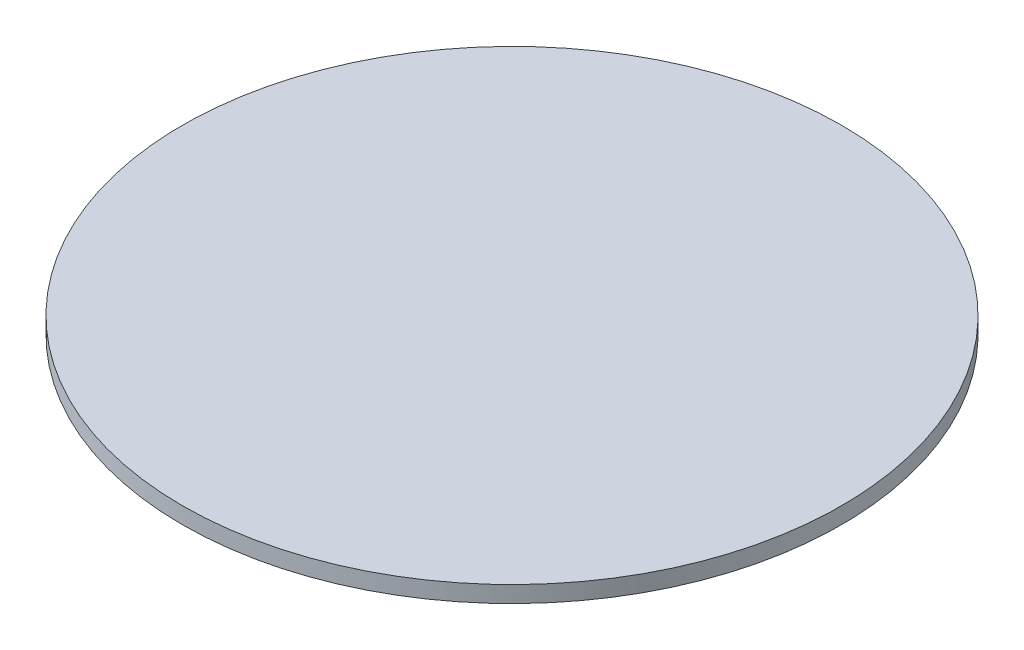
ISO-10303-21;
HEADER;
FILE_DESCRIPTION(('STEP AP214'),'2;1');
FILE_NAME('part.step','',(''),(''),'','','');
FILE_SCHEMA(('AUTOMOTIVE_DESIGN { 1 0 10303 214 1 1 1 1 }'));
ENDSEC;
DATA;
#1=APPLICATION_CONTEXT('core data for automotive mechanical design processes');
#2=APPLICATION_PROTOCOL_DEFINITION('international standard','automotive_design',2000,#1);
#3=PRODUCT_CONTEXT('',#1,'mechanical');
#4=PRODUCT('Part','Part','',(#3));
#5=PRODUCT_RELATED_PRODUCT_CATEGORY('part','',(#4));
#6=PRODUCT_DEFINITION_FORMATION('','',#4);
#7=PRODUCT_DEFINITION_CONTEXT('part definition',#1,'design');
#8=PRODUCT_DEFINITION('design','',#6,#7);
#9=PRODUCT_DEFINITION_SHAPE('','',#8);
#10=(LENGTH_UNIT() NAMED_UNIT(*) SI_UNIT(.MILLI.,.METRE.));
#11=(NAMED_UNIT(*) PLANE_ANGLE_UNIT() SI_UNIT($,.RADIAN.));
#12=(NAMED_UNIT(*) SI_UNIT($,.STERADIAN.) SOLID_ANGLE_UNIT());
#13=UNCERTAINTY_MEASURE_WITH_UNIT(LENGTH_MEASURE(1.E-05),#10,'distance_accuracy_value','');
#14=(GEOMETRIC_REPRESENTATION_CONTEXT(3) GLOBAL_UNCERTAINTY_ASSIGNED_CONTEXT((#13)) GLOBAL_UNIT_ASSIGNED_CONTEXT((#10,
#11,#12)) REPRESENTATION_CONTEXT('',''));
#15=CARTESIAN_POINT('',(0.,0.,0.));
#16=DIRECTION('',(0.,0.,1.));
#17=DIRECTION('',(1.,0.,0.));
#18=AXIS2_PLACEMENT_3D('',#15,#16,#17);
#19=CARTESIAN_POINT('',(0.,3.,0.));
#20=DIRECTION('',(0.,-1.,0.));
#21=DIRECTION('',(0.,0.,-1.));
#22=AXIS2_PLACEMENT_3D('',#19,#20,#21);
#23=CYLINDRICAL_SURFACE('',#22,60.);
#24=CARTESIAN_POINT('',(0.,3.,0.));
#25=DIRECTION('',(0.,1.,0.));
#26=DIRECTION('',(0.,0.,1.));
#27=AXIS2_PLACEMENT_3D('',#24,#25,#26);
#28=CIRCLE('',#27,60.);
#29=CARTESIAN_POINT('',(0.,3.,60.));
#30=VERTEX_POINT('',#29);
#31=EDGE_CURVE('E10',#30,#30,#28,.T.);
#32=ORIENTED_EDGE('',*,*,#31,.F.);
#33=EDGE_LOOP('',(#32));
#34=FACE_BOUND('',#33,.T.);
#35=CARTESIAN_POINT('',(0.,0.,0.));
#36=DIRECTION('',(0.,1.,0.));
#37=DIRECTION('',(0.,0.,1.));
#38=AXIS2_PLACEMENT_3D('',#35,#36,#37);
#39=CIRCLE('',#38,60.);
#40=CARTESIAN_POINT('',(0.,0.,60.));
#41=VERTEX_POINT('',#40);
#42=EDGE_CURVE('E34',#41,#41,#39,.T.);
#43=ORIENTED_EDGE('',*,*,#42,.T.);
#44=EDGE_LOOP('',(#43));
#45=FACE_BOUND('',#44,.T.);
#46=ADVANCED_FACE('F31',(#34,#45),#23,.T.);
#47=CARTESIAN_POINT('',(0.,3.,0.));
#48=DIRECTION('',(0.,1.,0.));
#49=DIRECTION('',(0.,0.,1.));
#50=AXIS2_PLACEMENT_3D('',#47,#48,#49);
#51=PLANE('',#50);
#52=ORIENTED_EDGE('',*,*,#31,.T.);
#53=EDGE_LOOP('',(#52));
#54=FACE_BOUND('',#53,.T.);
#55=ADVANCED_FACE('F46',(#54),#51,.T.);
#56=CARTESIAN_POINT('',(0.,0.,0.));
#57=DIRECTION('',(0.,1.,0.));
#58=DIRECTION('',(0.,0.,1.));
#59=AXIS2_PLACEMENT_3D('',#56,#57,#58);
#60=PLANE('',#59);
#61=ORIENTED_EDGE('',*,*,#42,.F.);
#62=EDGE_LOOP('',(#61));
#63=FACE_BOUND('',#62,.T.);
#64=ADVANCED_FACE('F44',(#63),#60,.F.);
#65=CLOSED_SHELL('',(#46,#55,#64));
#66=MANIFOLD_SOLID_BREP('B2',#65);
#67=ADVANCED_BREP_SHAPE_REPRESENTATION('',(#18,#66),#14);
#68=SHAPE_DEFINITION_REPRESENTATION(#9,#67);
ENDSEC;
END-ISO-10303-21;
